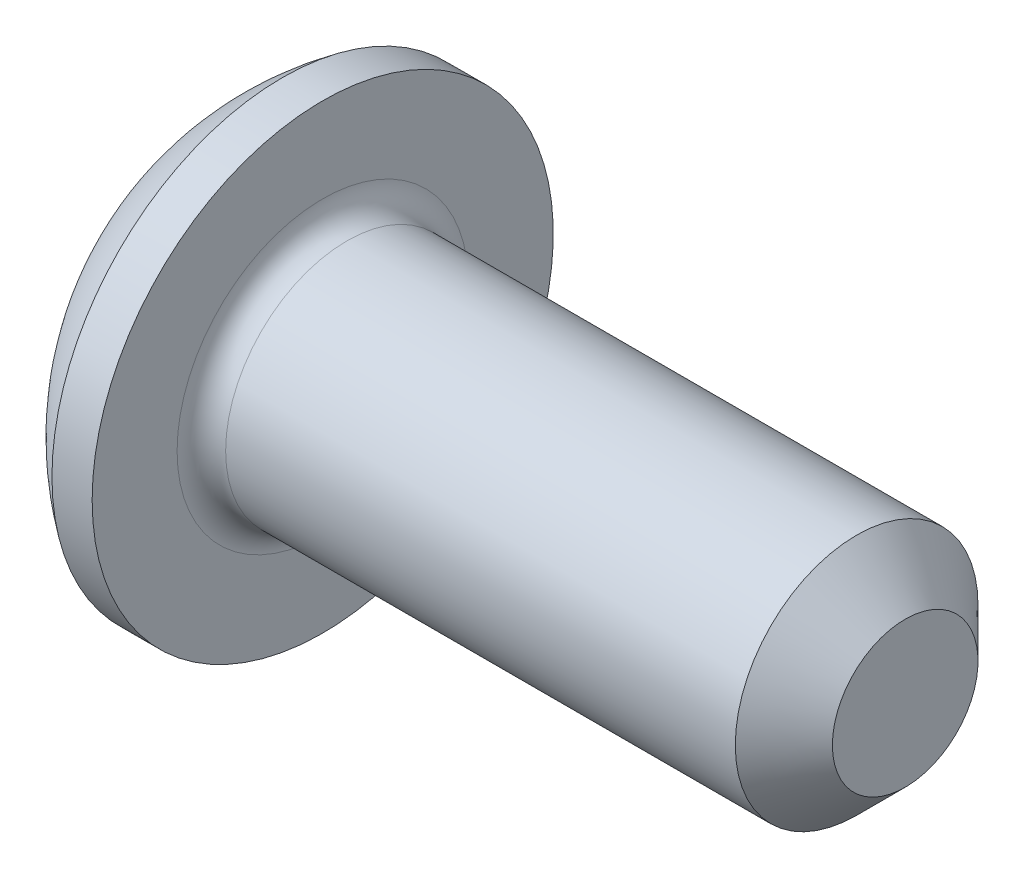
ISO-10303-21;
HEADER;
FILE_DESCRIPTION(('STEP AP214'),'2;1');
FILE_NAME('part.step','',(''),(''),'','','');
FILE_SCHEMA(('AUTOMOTIVE_DESIGN { 1 0 10303 214 1 1 1 1 }'));
ENDSEC;
DATA;
#1=APPLICATION_CONTEXT('core data for automotive mechanical design processes');
#2=APPLICATION_PROTOCOL_DEFINITION('international standard','automotive_design',2000,#1);
#3=PRODUCT_CONTEXT('',#1,'mechanical');
#4=PRODUCT('Part','Part','',(#3));
#5=PRODUCT_RELATED_PRODUCT_CATEGORY('part','',(#4));
#6=PRODUCT_DEFINITION_FORMATION('','',#4);
#7=PRODUCT_DEFINITION_CONTEXT('part definition',#1,'design');
#8=PRODUCT_DEFINITION('design','',#6,#7);
#9=PRODUCT_DEFINITION_SHAPE('','',#8);
#10=(LENGTH_UNIT() NAMED_UNIT(*) SI_UNIT(.MILLI.,.METRE.));
#11=(NAMED_UNIT(*) PLANE_ANGLE_UNIT() SI_UNIT($,.RADIAN.));
#12=(NAMED_UNIT(*) SI_UNIT($,.STERADIAN.) SOLID_ANGLE_UNIT());
#13=UNCERTAINTY_MEASURE_WITH_UNIT(LENGTH_MEASURE(1.E-05),#10,'distance_accuracy_value','');
#14=(GEOMETRIC_REPRESENTATION_CONTEXT(3) GLOBAL_UNCERTAINTY_ASSIGNED_CONTEXT((#13)) GLOBAL_UNIT_ASSIGNED_CONTEXT((#10,
#11,#12)) REPRESENTATION_CONTEXT('',''));
#15=CARTESIAN_POINT('',(0.,0.,0.));
#16=DIRECTION('',(0.,0.,1.));
#17=DIRECTION('',(1.,0.,0.));
#18=AXIS2_PLACEMENT_3D('',#15,#16,#17);
#19=CARTESIAN_POINT('',(0.5,0.,0.));
#20=DIRECTION('',(-1.,0.,0.));
#21=DIRECTION('',(0.,0.,1.));
#22=AXIS2_PLACEMENT_3D('',#19,#20,#21);
#23=TOROIDAL_SURFACE('',#22,3.,0.5);
#24=CARTESIAN_POINT('',(0.,0.,0.));
#25=DIRECTION('',(-1.,0.,0.));
#26=DIRECTION('',(0.,0.,1.));
#27=AXIS2_PLACEMENT_3D('',#24,#25,#26);
#28=CIRCLE('',#27,3.);
#29=CARTESIAN_POINT('',(0.,0.,3.));
#30=VERTEX_POINT('',#29);
#31=EDGE_CURVE('E45',#30,#30,#28,.T.);
#32=ORIENTED_EDGE('',*,*,#31,.F.);
#33=EDGE_LOOP('',(#32));
#34=FACE_BOUND('',#33,.T.);
#35=CARTESIAN_POINT('',(0.5,0.,0.));
#36=DIRECTION('',(-1.,0.,0.));
#37=DIRECTION('',(0.,0.,1.));
#38=AXIS2_PLACEMENT_3D('',#35,#36,#37);
#39=CIRCLE('',#38,2.5);
#40=CARTESIAN_POINT('',(0.5,0.,2.5));
#41=VERTEX_POINT('',#40);
#42=EDGE_CURVE('E140',#41,#41,#39,.T.);
#43=ORIENTED_EDGE('',*,*,#42,.T.);
#44=EDGE_LOOP('',(#43));
#45=FACE_BOUND('',#44,.T.);
#46=ADVANCED_FACE('F38',(#34,#45),#23,.F.);
#47=CARTESIAN_POINT('',(0.,4.75,0.));
#48=DIRECTION('',(-1.,0.,0.));
#49=DIRECTION('',(0.,0.,1.));
#50=AXIS2_PLACEMENT_3D('',#47,#48,#49);
#51=PLANE('',#50);
#52=CARTESIAN_POINT('',(0.,0.,0.));
#53=DIRECTION('',(-1.,0.,0.));
#54=DIRECTION('',(0.,0.,1.));
#55=AXIS2_PLACEMENT_3D('',#52,#53,#54);
#56=CIRCLE('',#55,4.75);
#57=CARTESIAN_POINT('',(0.,0.,4.75));
#58=VERTEX_POINT('',#57);
#59=EDGE_CURVE('E158',#58,#58,#56,.T.);
#60=ORIENTED_EDGE('',*,*,#59,.F.);
#61=EDGE_LOOP('',(#60));
#62=FACE_BOUND('',#61,.T.);
#63=ORIENTED_EDGE('',*,*,#31,.T.);
#64=EDGE_LOOP('',(#63));
#65=FACE_BOUND('',#64,.T.);
#66=ADVANCED_FACE('F163',(#62,#65),#51,.F.);
#67=CARTESIAN_POINT('',(-6.61159955338187,0.,0.));
#68=DIRECTION('',(-1.,0.,0.));
#69=DIRECTION('',(0.,0.,1.));
#70=AXIS2_PLACEMENT_3D('',#67,#68,#69);
#71=CYLINDRICAL_SURFACE('',#70,4.75);
#72=CARTESIAN_POINT('',(-0.828287848128524,0.,0.));
#73=DIRECTION('',(-1.,0.,0.));
#74=DIRECTION('',(0.,0.,1.));
#75=AXIS2_PLACEMENT_3D('',#72,#73,#74);
#76=CIRCLE('',#75,4.75);
#77=CARTESIAN_POINT('',(-0.828287848128523,4.75,0.));
#78=VERTEX_POINT('',#77);
#79=EDGE_CURVE('E155',#78,#78,#76,.T.);
#80=ORIENTED_EDGE('',*,*,#79,.F.);
#81=EDGE_LOOP('',(#80));
#82=FACE_BOUND('',#81,.T.);
#83=ORIENTED_EDGE('',*,*,#59,.T.);
#84=EDGE_LOOP('',(#83));
#85=FACE_BOUND('',#84,.T.);
#86=ADVANCED_FACE('F188',(#82,#85),#71,.T.);
#87=CARTESIAN_POINT('',(2.5,0.,0.));
#88=DIRECTION('',(-1.,0.,0.));
#89=DIRECTION('',(0.,1.,0.));
#90=AXIS2_PLACEMENT_3D('',#87,#88,#89);
#91=SPHERICAL_SURFACE('',#90,5.8);
#92=CARTESIAN_POINT('',(-2.75,0.,0.));
#93=DIRECTION('',(1.,0.,0.));
#94=DIRECTION('',(0.,1.,0.));
#95=AXIS2_PLACEMENT_3D('',#92,#93,#94);
#96=CIRCLE('',#95,2.46525860712421);
#97=CARTESIAN_POINT('',(-2.75,2.46525860712421,0.));
#98=VERTEX_POINT('',#97);
#99=EDGE_CURVE('E11',#98,#98,#96,.T.);
#100=CARTESIAN_POINT('',(-2.75,2.46525860712421,0.));
#101=CARTESIAN_POINT('',(-2.73663126286423,2.4937286470545,0.));
#102=CARTESIAN_POINT('',(-2.7230308992024,2.52208992064934,0.));
#103=CARTESIAN_POINT('',(-2.69537061423832,2.57858747600456,0.));
#104=CARTESIAN_POINT('',(-2.68131069293609,2.60672375776493,0.));
#105=CARTESIAN_POINT('',(-2.65273498810295,2.66276387028758,0.));
#106=CARTESIAN_POINT('',(-2.63821920457205,2.69066770104987,0.));
#107=CARTESIAN_POINT('',(-2.60873562393221,2.74623552988898,0.));
#108=CARTESIAN_POINT('',(-2.59376782682326,2.77389952796579,0.));
#109=CARTESIAN_POINT('',(-2.56338417857594,2.8289803689457,0.));
#110=CARTESIAN_POINT('',(-2.54796832743756,2.85639721184878,0.));
#111=CARTESIAN_POINT('',(-2.51669265160231,2.91097648655088,0.));
#112=CARTESIAN_POINT('',(-2.50083282690543,2.93813891834989,0.));
#113=CARTESIAN_POINT('',(-2.46867340129971,2.99220218193927,0.));
#114=CARTESIAN_POINT('',(-2.45237380039086,3.01910301372964,0.));
#115=CARTESIAN_POINT('',(-2.41933913626736,3.07263595771478,0.));
#116=CARTESIAN_POINT('',(-2.40260407305271,3.09926806990954,0.));
#117=CARTESIAN_POINT('',(-2.36870291342873,3.1522565262141,0.));
#118=CARTESIAN_POINT('',(-2.35153681701939,3.17861287032389,0.));
#119=CARTESIAN_POINT('',(-2.31677813420693,3.23104281496011,0.));
#120=CARTESIAN_POINT('',(-2.2991855478038,3.25711641548654,0.));
#121=CARTESIAN_POINT('',(-2.26357854107675,3.30897397228733,0.));
#122=CARTESIAN_POINT('',(-2.24556412075282,3.33475792856168,0.));
#123=CARTESIAN_POINT('',(-2.20911821390105,3.38602937284758,0.));
#124=CARTESIAN_POINT('',(-2.19068672737321,3.41151686085912,0.));
#125=CARTESIAN_POINT('',(-2.15341156621149,3.46218862307218,0.));
#126=CARTESIAN_POINT('',(-2.13456789157762,3.4873728972737,0.));
#127=CARTESIAN_POINT('',(-2.09647334139192,3.53743156656842,0.));
#128=CARTESIAN_POINT('',(-2.0772224658401,3.56230596166163,0.));
#129=CARTESIAN_POINT('',(-2.03831860877686,3.6117382894544,0.));
#130=CARTESIAN_POINT('',(-2.01866562726544,3.63629622215397,0.));
#131=CARTESIAN_POINT('',(-1.97896275966314,3.68508912562941,0.));
#132=CARTESIAN_POINT('',(-1.95891287357227,3.70932409640528,0.));
#133=CARTESIAN_POINT('',(-1.91842150323643,3.75746466197877,0.));
#134=CARTESIAN_POINT('',(-1.89798001899147,3.78137025677638,0.));
#135=CARTESIAN_POINT('',(-1.85671086241364,3.82884574351179,0.));
#136=CARTESIAN_POINT('',(-1.83588319008077,3.85241563544958,0.));
#137=CARTESIAN_POINT('',(-1.79384716960225,3.89921347843127,0.));
#138=CARTESIAN_POINT('',(-1.77263882145661,3.92244142947517,0.));
#139=CARTESIAN_POINT('',(-1.72984706237779,3.96854924313348,0.));
#140=CARTESIAN_POINT('',(-1.70826365144462,3.99142910574789,0.));
#141=CARTESIAN_POINT('',(-1.6647274790805,4.03683468713708,0.));
#142=CARTESIAN_POINT('',(-1.64277471764955,4.05936040591186,0.));
#143=CARTESIAN_POINT('',(-1.59850565433241,4.10405173793981,0.));
#144=CARTESIAN_POINT('',(-1.57618935244621,4.12621735119298,0.));
#145=CARTESIAN_POINT('',(-1.53119911447597,4.17018260580145,0.));
#146=CARTESIAN_POINT('',(-1.50852517839191,4.19198224715676,0.));
#147=CARTESIAN_POINT('',(-1.46282567293579,4.23520978845256,0.));
#148=CARTESIAN_POINT('',(-1.43980010356371,4.25663768839306,0.));
#149=CARTESIAN_POINT('',(-1.39340342550291,4.29911607572488,0.));
#150=CARTESIAN_POINT('',(-1.37003231681418,4.32016656311622,0.));
#151=CARTESIAN_POINT('',(-1.32295074555017,4.36188455411266,0.));
#152=CARTESIAN_POINT('',(-1.29924028297488,4.38255205771778,0.));
#153=CARTESIAN_POINT('',(-1.25148627915218,4.42349861122508,0.));
#154=CARTESIAN_POINT('',(-1.22744273790476,4.44377766112727,0.));
#155=CARTESIAN_POINT('',(-1.17902894021505,4.48394194027202,0.));
#156=CARTESIAN_POINT('',(-1.15465868377274,4.50382716951459,0.));
#157=CARTESIAN_POINT('',(-1.10559790522945,4.54319854404732,0.));
#158=CARTESIAN_POINT('',(-1.08090738312846,4.56268468933748,0.));
#159=CARTESIAN_POINT('',(-1.03121260909539,4.60125274040362,0.));
#160=CARTESIAN_POINT('',(-1.0062083571633,4.62033464617959,0.));
#161=CARTESIAN_POINT('',(-0.955892736619524,4.6580891617712,0.));
#162=CARTESIAN_POINT('',(-0.930581368007839,4.67676177158685,0.));
#163=CARTESIAN_POINT('',(-0.879658229841375,4.71369277651074,0.));
#164=CARTESIAN_POINT('',(-0.854046460286596,4.73195117161898,0.));
#165=CARTESIAN_POINT('',(-0.828287848128523,4.75,0.));
#166=B_SPLINE_CURVE_WITH_KNOTS('',3,(#100,#101,#102,#103,#104,#105,#106,#107,#108,#109,#110,
#111,#112,#113,#114,#115,#116,#117,#118,#119,#120,#121,#122,#123,#124,#125,#126,#127,#128,#129,
#130,#131,#132,#133,#134,#135,#136,#137,#138,#139,#140,#141,#142,#143,#144,#145,#146,#147,#148,
#149,#150,#151,#152,#153,#154,#155,#156,#157,#158,#159,#160,#161,#162,#163,#164,#165),
.UNSPECIFIED.,.F.,.F.,(4,2,2,2,2,2,2,2,2,2,2,2,2,2,2,2,2,2,2,2,2,2,2,2,2,2,2,2,2,2,2,2,4),(0.,
0.0943567706699315,0.188713541339863,0.283070312009794,0.377427082679724,0.471783853349656,
0.566140624019587,0.660497394689518,0.754854165359448,0.849210936029381,0.943567706699311,
1.03792447736924,1.13228124803917,1.2266380187091,1.32099478937904,1.41535156004897,
1.5097083307189,1.60406510138883,1.69842187205876,1.79277864272869,1.88713541339862,
1.98149218406855,2.07584895473848,2.17020572540841,2.26456249607835,2.35891926674828,
2.45327603741821,2.54763280808814,2.64198957875807,2.736346349428,2.83070312009793,
2.92505989076786,3.01941666143779),.UNSPECIFIED.);
#167=EDGE_CURVE('BSEAM183',#98,#78,#166,.T.);
#168=ORIENTED_EDGE('',*,*,#99,.T.);
#169=ORIENTED_EDGE('',*,*,#79,.T.);
#170=ORIENTED_EDGE('',*,*,#167,.T.);
#171=ORIENTED_EDGE('',*,*,#167,.F.);
#172=EDGE_LOOP('',(#168,#170,#169,#171));
#173=FACE_BOUND('',#172,.T.);
#174=ADVANCED_FACE('F183',(#173),#91,.T.);
#175=CARTESIAN_POINT('',(12.,1.5,0.));
#176=DIRECTION('',(-1.,0.,0.));
#177=DIRECTION('',(0.,0.,1.));
#178=AXIS2_PLACEMENT_3D('',#175,#176,#177);
#179=PLANE('',#178);
#180=CARTESIAN_POINT('',(12.,0.,0.));
#181=DIRECTION('',(-1.,0.,0.));
#182=DIRECTION('',(0.,0.,1.));
#183=AXIS2_PLACEMENT_3D('',#180,#181,#182);
#184=CIRCLE('',#183,1.5);
#185=CARTESIAN_POINT('',(12.,0.,1.5));
#186=VERTEX_POINT('',#185);
#187=EDGE_CURVE('E152',#186,#186,#184,.T.);
#188=ORIENTED_EDGE('',*,*,#187,.F.);
#189=EDGE_LOOP('',(#188));
#190=FACE_BOUND('',#189,.T.);
#191=ADVANCED_FACE('F178',(#190),#179,.F.);
#192=CARTESIAN_POINT('',(12.,0.,0.));
#193=DIRECTION('',(-1.,0.,0.));
#194=DIRECTION('',(0.,0.,1.));
#195=AXIS2_PLACEMENT_3D('',#192,#193,#194);
#196=CONICAL_SURFACE('',#195,1.5,0.785398163397446);
#197=CARTESIAN_POINT('',(11.,0.,0.));
#198=DIRECTION('',(-1.,0.,0.));
#199=DIRECTION('',(0.,0.,1.));
#200=AXIS2_PLACEMENT_3D('',#197,#198,#199);
#201=CIRCLE('',#200,2.5);
#202=CARTESIAN_POINT('',(11.,0.,2.5));
#203=VERTEX_POINT('',#202);
#204=EDGE_CURVE('E149',#203,#203,#201,.T.);
#205=ORIENTED_EDGE('',*,*,#204,.F.);
#206=EDGE_LOOP('',(#205));
#207=FACE_BOUND('',#206,.T.);
#208=ORIENTED_EDGE('',*,*,#187,.T.);
#209=EDGE_LOOP('',(#208));
#210=FACE_BOUND('',#209,.T.);
#211=ADVANCED_FACE('F172',(#207,#210),#196,.T.);
#212=CARTESIAN_POINT('',(-6.61159955338187,0.,0.));
#213=DIRECTION('',(-1.,0.,0.));
#214=DIRECTION('',(0.,0.,1.));
#215=AXIS2_PLACEMENT_3D('',#212,#213,#214);
#216=CYLINDRICAL_SURFACE('',#215,2.5);
#217=ORIENTED_EDGE('',*,*,#42,.F.);
#218=EDGE_LOOP('',(#217));
#219=FACE_BOUND('',#218,.T.);
#220=ORIENTED_EDGE('',*,*,#204,.T.);
#221=EDGE_LOOP('',(#220));
#222=FACE_BOUND('',#221,.T.);
#223=ADVANCED_FACE('F169',(#219,#222),#216,.T.);
#224=CARTESIAN_POINT('',(-2.75,2.46525860712421,29.2018540582017));
#225=DIRECTION('',(1.,0.,0.));
#226=DIRECTION('',(0.,1.,0.));
#227=AXIS2_PLACEMENT_3D('',#224,#225,#226);
#228=PLANE('',#227);
#229=DIRECTION('',(0.,-0.866025403784439,0.5));
#230=VECTOR('',#229,1.);
#231=CARTESIAN_POINT('',(-2.75,0.,-1.73205080756888));
#232=LINE('',#231,#230);
#233=CARTESIAN_POINT('',(-2.75,0.,-1.73205080756888));
#234=VERTEX_POINT('',#233);
#235=CARTESIAN_POINT('',(-2.75,-1.5,-0.86602540378444));
#236=VERTEX_POINT('',#235);
#237=EDGE_CURVE('E106',#234,#236,#232,.T.);
#238=ORIENTED_EDGE('',*,*,#237,.F.);
#239=DIRECTION('',(0.,-0.866025403784439,-0.5));
#240=VECTOR('',#239,1.);
#241=CARTESIAN_POINT('',(-2.75,1.5,-0.866025403784439));
#242=LINE('',#241,#240);
#243=CARTESIAN_POINT('',(-2.75,1.5,-0.866025403784439));
#244=VERTEX_POINT('',#243);
#245=EDGE_CURVE('E52',#244,#234,#242,.T.);
#246=ORIENTED_EDGE('',*,*,#245,.F.);
#247=DIRECTION('',(0.,0.,-1.));
#248=VECTOR('',#247,1.);
#249=CARTESIAN_POINT('',(-2.75,1.5,0.866025403784439));
#250=LINE('',#249,#248);
#251=CARTESIAN_POINT('',(-2.75,1.5,0.866025403784439));
#252=VERTEX_POINT('',#251);
#253=EDGE_CURVE('E122',#252,#244,#250,.T.);
#254=ORIENTED_EDGE('',*,*,#253,.F.);
#255=DIRECTION('',(0.,0.866025403784439,-0.5));
#256=VECTOR('',#255,1.);
#257=CARTESIAN_POINT('',(-2.75,0.,1.73205080756888));
#258=LINE('',#257,#256);
#259=CARTESIAN_POINT('',(-2.75,0.,1.73205080756888));
#260=VERTEX_POINT('',#259);
#261=EDGE_CURVE('E116',#260,#252,#258,.T.);
#262=ORIENTED_EDGE('',*,*,#261,.F.);
#263=DIRECTION('',(0.,0.866025403784439,0.5));
#264=VECTOR('',#263,1.);
#265=CARTESIAN_POINT('',(-2.75,-1.5,0.866025403784438));
#266=LINE('',#265,#264);
#267=CARTESIAN_POINT('',(-2.75,-1.5,0.866025403784438));
#268=VERTEX_POINT('',#267);
#269=EDGE_CURVE('E114',#268,#260,#266,.T.);
#270=ORIENTED_EDGE('',*,*,#269,.F.);
#271=DIRECTION('',(0.,0.,1.));
#272=VECTOR('',#271,1.);
#273=CARTESIAN_POINT('',(-2.75,-1.5,-0.86602540378444));
#274=LINE('',#273,#272);
#275=EDGE_CURVE('E95',#236,#268,#274,.T.);
#276=ORIENTED_EDGE('',*,*,#275,.F.);
#277=EDGE_LOOP('',(#238,#246,#254,#262,#270,#276));
#278=FACE_BOUND('',#277,.T.);
#279=ORIENTED_EDGE('',*,*,#99,.F.);
#280=EDGE_LOOP('',(#279));
#281=FACE_BOUND('',#280,.T.);
#282=ADVANCED_FACE('F110',(#278,#281),#228,.F.);
#283=CARTESIAN_POINT('',(-0.95,1.5,-0.866025403784439));
#284=DIRECTION('',(0.,0.5,-0.866025403784438));
#285=DIRECTION('',(0.,0.866025403784439,0.5));
#286=AXIS2_PLACEMENT_3D('',#283,#284,#285);
#287=PLANE('',#286);
#288=ORIENTED_EDGE('',*,*,#245,.T.);
#289=DIRECTION('',(-1.,0.,0.));
#290=VECTOR('',#289,1.);
#291=CARTESIAN_POINT('',(-0.95,0.,-1.73205080756888));
#292=LINE('',#291,#290);
#293=CARTESIAN_POINT('',(-0.95,0.,-1.73205080756888));
#294=VERTEX_POINT('',#293);
#295=EDGE_CURVE('E103',#294,#234,#292,.T.);
#296=ORIENTED_EDGE('',*,*,#295,.F.);
#297=DIRECTION('',(0.,-0.866025403784439,-0.5));
#298=VECTOR('',#297,1.);
#299=CARTESIAN_POINT('',(-0.95,1.5,-0.866025403784439));
#300=LINE('',#299,#298);
#301=CARTESIAN_POINT('',(-0.95,1.5,-0.866025403784439));
#302=VERTEX_POINT('',#301);
#303=EDGE_CURVE('E124',#302,#294,#300,.T.);
#304=ORIENTED_EDGE('',*,*,#303,.F.);
#305=DIRECTION('',(-1.,0.,0.));
#306=VECTOR('',#305,1.);
#307=CARTESIAN_POINT('',(-0.95,1.5,-0.866025403784439));
#308=LINE('',#307,#306);
#309=EDGE_CURVE('E59',#302,#244,#308,.T.);
#310=ORIENTED_EDGE('',*,*,#309,.T.);
#311=EDGE_LOOP('',(#288,#296,#304,#310));
#312=FACE_BOUND('',#311,.T.);
#313=ADVANCED_FACE('F225',(#312),#287,.F.);
#314=CARTESIAN_POINT('',(-0.95,1.5,0.866025403784439));
#315=DIRECTION('',(0.,1.,0.));
#316=DIRECTION('',(-1.,0.,0.));
#317=AXIS2_PLACEMENT_3D('',#314,#315,#316);
#318=PLANE('',#317);
#319=ORIENTED_EDGE('',*,*,#253,.T.);
#320=ORIENTED_EDGE('',*,*,#309,.F.);
#321=DIRECTION('',(0.,0.,-1.));
#322=VECTOR('',#321,1.);
#323=CARTESIAN_POINT('',(-0.95,1.5,0.866025403784439));
#324=LINE('',#323,#322);
#325=CARTESIAN_POINT('',(-0.95,1.5,0.866025403784439));
#326=VERTEX_POINT('',#325);
#327=EDGE_CURVE('E136',#326,#302,#324,.T.);
#328=ORIENTED_EDGE('',*,*,#327,.F.);
#329=DIRECTION('',(-1.,0.,0.));
#330=VECTOR('',#329,1.);
#331=CARTESIAN_POINT('',(-0.95,1.5,0.866025403784439));
#332=LINE('',#331,#330);
#333=EDGE_CURVE('E141',#326,#252,#332,.T.);
#334=ORIENTED_EDGE('',*,*,#333,.T.);
#335=EDGE_LOOP('',(#319,#320,#328,#334));
#336=FACE_BOUND('',#335,.T.);
#337=ADVANCED_FACE('F234',(#336),#318,.F.);
#338=CARTESIAN_POINT('',(-0.95,0.,1.73205080756888));
#339=DIRECTION('',(0.,0.5,0.866025403784439));
#340=DIRECTION('',(0.,-0.866025403784439,0.5));
#341=AXIS2_PLACEMENT_3D('',#338,#339,#340);
#342=PLANE('',#341);
#343=ORIENTED_EDGE('',*,*,#261,.T.);
#344=ORIENTED_EDGE('',*,*,#333,.F.);
#345=DIRECTION('',(0.,0.866025403784439,-0.5));
#346=VECTOR('',#345,1.);
#347=CARTESIAN_POINT('',(-0.95,0.,1.73205080756888));
#348=LINE('',#347,#346);
#349=CARTESIAN_POINT('',(-0.95,0.,1.73205080756888));
#350=VERTEX_POINT('',#349);
#351=EDGE_CURVE('E133',#350,#326,#348,.T.);
#352=ORIENTED_EDGE('',*,*,#351,.F.);
#353=DIRECTION('',(-1.,0.,0.));
#354=VECTOR('',#353,1.);
#355=CARTESIAN_POINT('',(-0.95,0.,1.73205080756888));
#356=LINE('',#355,#354);
#357=EDGE_CURVE('E143',#350,#260,#356,.T.);
#358=ORIENTED_EDGE('',*,*,#357,.T.);
#359=EDGE_LOOP('',(#343,#344,#352,#358));
#360=FACE_BOUND('',#359,.T.);
#361=ADVANCED_FACE('F243',(#360),#342,.F.);
#362=CARTESIAN_POINT('',(-0.949999999999999,-1.5,0.866025403784438));
#363=DIRECTION('',(0.,-0.5,0.866025403784438));
#364=DIRECTION('',(0.,-0.866025403784439,-0.5));
#365=AXIS2_PLACEMENT_3D('',#362,#363,#364);
#366=PLANE('',#365);
#367=ORIENTED_EDGE('',*,*,#269,.T.);
#368=ORIENTED_EDGE('',*,*,#357,.F.);
#369=DIRECTION('',(0.,0.866025403784439,0.5));
#370=VECTOR('',#369,1.);
#371=CARTESIAN_POINT('',(-0.949999999999999,-1.5,0.866025403784438));
#372=LINE('',#371,#370);
#373=CARTESIAN_POINT('',(-0.949999999999999,-1.5,0.866025403784438));
#374=VERTEX_POINT('',#373);
#375=EDGE_CURVE('E130',#374,#350,#372,.T.);
#376=ORIENTED_EDGE('',*,*,#375,.F.);
#377=DIRECTION('',(-1.,0.,0.));
#378=VECTOR('',#377,1.);
#379=CARTESIAN_POINT('',(-0.949999999999999,-1.5,0.866025403784438));
#380=LINE('',#379,#378);
#381=EDGE_CURVE('E102',#374,#268,#380,.T.);
#382=ORIENTED_EDGE('',*,*,#381,.T.);
#383=EDGE_LOOP('',(#367,#368,#376,#382));
#384=FACE_BOUND('',#383,.T.);
#385=ADVANCED_FACE('F252',(#384),#366,.F.);
#386=CARTESIAN_POINT('',(-0.949999999999999,-1.5,-0.86602540378444));
#387=DIRECTION('',(0.,-1.,0.));
#388=DIRECTION('',(1.,0.,0.));
#389=AXIS2_PLACEMENT_3D('',#386,#387,#388);
#390=PLANE('',#389);
#391=ORIENTED_EDGE('',*,*,#275,.T.);
#392=ORIENTED_EDGE('',*,*,#381,.F.);
#393=DIRECTION('',(0.,0.,1.));
#394=VECTOR('',#393,1.);
#395=CARTESIAN_POINT('',(-0.949999999999999,-1.5,-0.86602540378444));
#396=LINE('',#395,#394);
#397=CARTESIAN_POINT('',(-0.949999999999999,-1.5,-0.86602540378444));
#398=VERTEX_POINT('',#397);
#399=EDGE_CURVE('E98',#398,#374,#396,.T.);
#400=ORIENTED_EDGE('',*,*,#399,.F.);
#401=DIRECTION('',(-1.,0.,0.));
#402=VECTOR('',#401,1.);
#403=CARTESIAN_POINT('',(-0.949999999999999,-1.5,-0.86602540378444));
#404=LINE('',#403,#402);
#405=EDGE_CURVE('E91',#398,#236,#404,.T.);
#406=ORIENTED_EDGE('',*,*,#405,.T.);
#407=EDGE_LOOP('',(#391,#392,#400,#406));
#408=FACE_BOUND('',#407,.T.);
#409=ADVANCED_FACE('F93',(#408),#390,.F.);
#410=CARTESIAN_POINT('',(-0.95,0.,-1.73205080756888));
#411=DIRECTION('',(0.,-0.5,-0.866025403784439));
#412=DIRECTION('',(0.,0.866025403784439,-0.5));
#413=AXIS2_PLACEMENT_3D('',#410,#411,#412);
#414=PLANE('',#413);
#415=ORIENTED_EDGE('',*,*,#237,.T.);
#416=ORIENTED_EDGE('',*,*,#405,.F.);
#417=DIRECTION('',(0.,-0.866025403784439,0.5));
#418=VECTOR('',#417,1.);
#419=CARTESIAN_POINT('',(-0.95,0.,-1.73205080756888));
#420=LINE('',#419,#418);
#421=EDGE_CURVE('E127',#294,#398,#420,.T.);
#422=ORIENTED_EDGE('',*,*,#421,.F.);
#423=ORIENTED_EDGE('',*,*,#295,.T.);
#424=EDGE_LOOP('',(#415,#416,#422,#423));
#425=FACE_BOUND('',#424,.T.);
#426=ADVANCED_FACE('F107',(#425),#414,.F.);
#427=CARTESIAN_POINT('',(-0.95,3.,0.));
#428=DIRECTION('',(1.,0.,0.));
#429=DIRECTION('',(0.,1.,0.));
#430=AXIS2_PLACEMENT_3D('',#427,#428,#429);
#431=PLANE('',#430);
#432=ORIENTED_EDGE('',*,*,#303,.T.);
#433=ORIENTED_EDGE('',*,*,#421,.T.);
#434=ORIENTED_EDGE('',*,*,#399,.T.);
#435=ORIENTED_EDGE('',*,*,#375,.T.);
#436=ORIENTED_EDGE('',*,*,#351,.T.);
#437=ORIENTED_EDGE('',*,*,#327,.T.);
#438=EDGE_LOOP('',(#432,#433,#434,#435,#436,#437));
#439=FACE_BOUND('',#438,.T.);
#440=ADVANCED_FACE('F279',(#439),#431,.F.);
#441=CLOSED_SHELL('',(#46,#66,#86,#174,#191,#211,#223,#282,#313,#337,#361,#385,#409,#426,#440));
#442=MANIFOLD_SOLID_BREP('B2',#441);
#443=ADVANCED_BREP_SHAPE_REPRESENTATION('',(#18,#442),#14);
#444=SHAPE_DEFINITION_REPRESENTATION(#9,#443);
ENDSEC;
END-ISO-10303-21;
